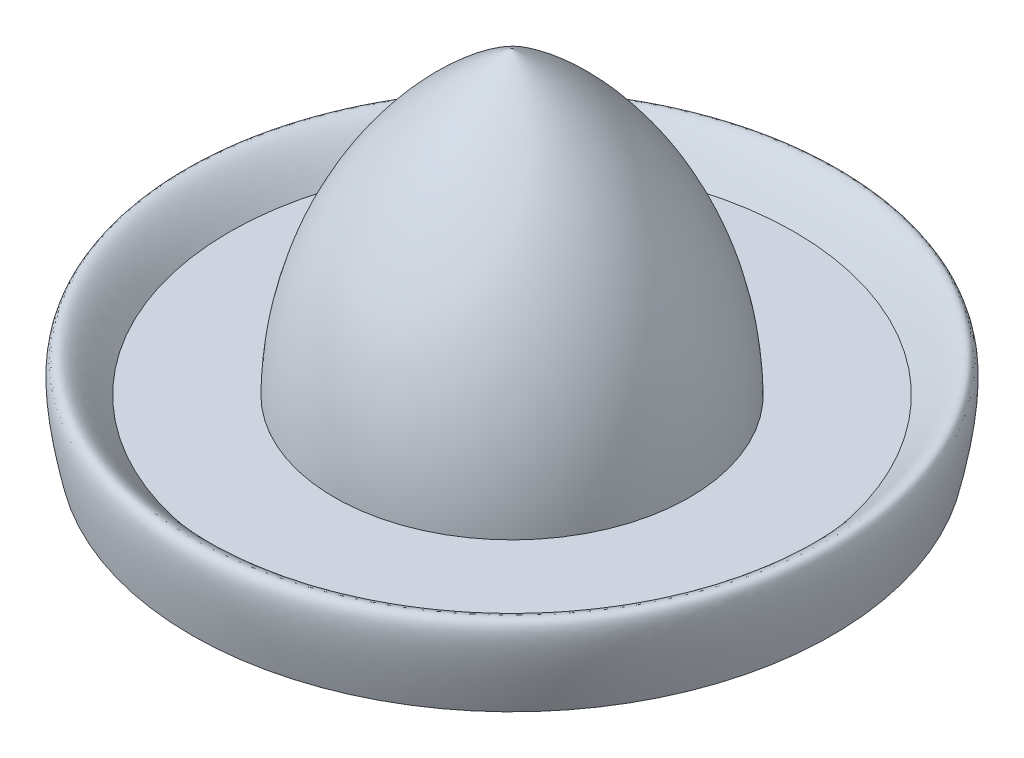
ISO-10303-21;
HEADER;
FILE_DESCRIPTION(('STEP AP214'),'2;1');
FILE_NAME('part.step','',(''),(''),'','','');
FILE_SCHEMA(('AUTOMOTIVE_DESIGN { 1 0 10303 214 1 1 1 1 }'));
ENDSEC;
DATA;
#1=APPLICATION_CONTEXT('core data for automotive mechanical design processes');
#2=APPLICATION_PROTOCOL_DEFINITION('international standard','automotive_design',2000,#1);
#3=PRODUCT_CONTEXT('',#1,'mechanical');
#4=PRODUCT('Part','Part','',(#3));
#5=PRODUCT_RELATED_PRODUCT_CATEGORY('part','',(#4));
#6=PRODUCT_DEFINITION_FORMATION('','',#4);
#7=PRODUCT_DEFINITION_CONTEXT('part definition',#1,'design');
#8=PRODUCT_DEFINITION('design','',#6,#7);
#9=PRODUCT_DEFINITION_SHAPE('','',#8);
#10=(LENGTH_UNIT() NAMED_UNIT(*) SI_UNIT(.MILLI.,.METRE.));
#11=(NAMED_UNIT(*) PLANE_ANGLE_UNIT() SI_UNIT($,.RADIAN.));
#12=(NAMED_UNIT(*) SI_UNIT($,.STERADIAN.) SOLID_ANGLE_UNIT());
#13=UNCERTAINTY_MEASURE_WITH_UNIT(LENGTH_MEASURE(1.E-05),#10,'distance_accuracy_value','');
#14=(GEOMETRIC_REPRESENTATION_CONTEXT(3) GLOBAL_UNCERTAINTY_ASSIGNED_CONTEXT((#13)) GLOBAL_UNIT_ASSIGNED_CONTEXT((#10,
#11,#12)) REPRESENTATION_CONTEXT('',''));
#15=CARTESIAN_POINT('',(0.,0.,0.));
#16=DIRECTION('',(0.,0.,1.));
#17=DIRECTION('',(1.,0.,0.));
#18=AXIS2_PLACEMENT_3D('',#15,#16,#17);
#19=CARTESIAN_POINT('',(0.,0.,-27.7002199708771));
#20=CARTESIAN_POINT('',(0.,11.8384178906218,-30.3370162707357));
#21=CARTESIAN_POINT('',(0.,4.15503299563157,-24.4265576106825));
#22=B_SPLINE_CURVE_WITH_KNOTS('',2,(#19,#20,#21),.UNSPECIFIED.,.F.,.F.,(3,3),(0.,1.),.UNSPECIFIED.);
#23=CARTESIAN_POINT('',(0.,0.,0.));
#24=DIRECTION('',(0.,-1.,0.));
#25=AXIS1_PLACEMENT('',#23,#24);
#26=SURFACE_OF_REVOLUTION('',#22,#25);
#27=CARTESIAN_POINT('',(0.,4.15503299563157,0.));
#28=DIRECTION('',(0.,-1.,0.));
#29=DIRECTION('',(0.,0.,-1.));
#30=AXIS2_PLACEMENT_3D('',#27,#28,#29);
#31=CIRCLE('',#30,24.4265576106825);
#32=CARTESIAN_POINT('',(0.,4.15503299563157,-24.4265576106825));
#33=VERTEX_POINT('',#32);
#34=EDGE_CURVE('E57',#33,#33,#31,.T.);
#35=ORIENTED_EDGE('',*,*,#34,.T.);
#36=EDGE_LOOP('',(#35));
#37=FACE_BOUND('',#36,.T.);
#38=CARTESIAN_POINT('',(0.,0.,0.));
#39=DIRECTION('',(0.,-1.,0.));
#40=DIRECTION('',(0.,0.,-1.));
#41=AXIS2_PLACEMENT_3D('',#38,#39,#40);
#42=CIRCLE('',#41,27.7002199708771);
#43=CARTESIAN_POINT('',(0.,0.,-27.7002199708771));
#44=VERTEX_POINT('',#43);
#45=EDGE_CURVE('E11',#44,#44,#42,.T.);
#46=ORIENTED_EDGE('',*,*,#45,.F.);
#47=EDGE_LOOP('',(#46));
#48=FACE_BOUND('',#47,.T.);
#49=ADVANCED_FACE('F33',(#37,#48),#26,.F.);
#50=CARTESIAN_POINT('',(0.,0.,-12.6744627212204));
#51=DIRECTION('',(0.,-1.,0.));
#52=DIRECTION('',(0.,0.,-1.));
#53=AXIS2_PLACEMENT_3D('',#50,#51,#52);
#54=PLANE('',#53);
#55=ORIENTED_EDGE('',*,*,#45,.T.);
#56=EDGE_LOOP('',(#55));
#57=FACE_BOUND('',#56,.T.);
#58=CARTESIAN_POINT('',(0.,0.,0.));
#59=DIRECTION('',(0.,-1.,0.));
#60=DIRECTION('',(0.,0.,-1.));
#61=AXIS2_PLACEMENT_3D('',#58,#59,#60);
#62=CIRCLE('',#61,12.6744627212204);
#63=CARTESIAN_POINT('',(0.,0.,-12.6744627212204));
#64=VERTEX_POINT('',#63);
#65=EDGE_CURVE('E41',#64,#64,#62,.T.);
#66=ORIENTED_EDGE('',*,*,#65,.F.);
#67=EDGE_LOOP('',(#66));
#68=FACE_BOUND('',#67,.T.);
#69=ADVANCED_FACE('F77',(#57,#68),#54,.T.);
#70=CARTESIAN_POINT('',(0.,2.14352921775327,18.9944099764996));
#71=DIRECTION('',(-1.,0.,0.));
#72=DIRECTION('',(0.,0.,-1.));
#73=AXIS2_PLACEMENT_3D('',#70,#71,#72);
#74=CIRCLE('',#73,31.7413329186371);
#75=TRIMMED_CURVE('',#74,(PARAMETER_VALUE(-0.929278135909203)),
(PARAMETER_VALUE(0.929278135909203)),.T.,.PARAMETER.);
#76=CARTESIAN_POINT('',(0.,2.14352921775327,0.));
#77=DIRECTION('',(0.,-1.,0.));
#78=AXIS1_PLACEMENT('',#76,#77);
#79=SURFACE_OF_REVOLUTION('',#75,#78);
#80=ORIENTED_EDGE('',*,*,#65,.T.);
#81=EDGE_LOOP('',(#80));
#82=FACE_BOUND('',#81,.T.);
#83=CARTESIAN_POINT('',(0.,27.5743098801004,0.));
#84=VERTEX_POINT('',#83);
#85=VERTEX_LOOP('',#84);
#86=FACE_BOUND('',#85,.T.);
#87=ADVANCED_FACE('F51',(#82,#86),#79,.F.);
#88=CARTESIAN_POINT('',(0.,3.73416746957279,14.9281615484272));
#89=DIRECTION('',(-1.,0.,0.));
#90=DIRECTION('',(0.,0.,-1.));
#91=AXIS2_PLACEMENT_3D('',#88,#89,#90);
#92=CIRCLE('',#91,30.2921164258213);
#93=TRIMMED_CURVE('',#92,(PARAMETER_VALUE(-1.05548379469308)),
(PARAMETER_VALUE(1.05548379469308)),.T.,.PARAMETER.);
#94=CARTESIAN_POINT('',(0.,3.73416746957279,0.));
#95=DIRECTION('',(0.,-1.,0.));
#96=AXIS1_PLACEMENT('',#94,#95);
#97=SURFACE_OF_REVOLUTION('',#93,#96);
#98=CARTESIAN_POINT('',(0.,30.0925116956347,0.));
#99=VERTEX_POINT('',#98);
#100=VERTEX_LOOP('',#99);
#101=FACE_BOUND('',#100,.T.);
#102=CARTESIAN_POINT('',(0.,4.15503299563157,0.));
#103=DIRECTION('',(0.,-1.,0.));
#104=DIRECTION('',(0.,0.,-1.));
#105=AXIS2_PLACEMENT_3D('',#102,#103,#104);
#106=CIRCLE('',#105,15.3610310747591);
#107=CARTESIAN_POINT('',(0.,4.15503299563157,-15.3610310747591));
#108=VERTEX_POINT('',#107);
#109=EDGE_CURVE('E55',#108,#108,#106,.T.);
#110=ORIENTED_EDGE('',*,*,#109,.F.);
#111=EDGE_LOOP('',(#110));
#112=FACE_BOUND('',#111,.T.);
#113=ADVANCED_FACE('F47',(#101,#112),#97,.T.);
#114=CARTESIAN_POINT('',(0.,4.15503299563157,-15.3610310747591));
#115=DIRECTION('',(0.,1.,0.));
#116=DIRECTION('',(0.,0.,1.));
#117=AXIS2_PLACEMENT_3D('',#114,#115,#116);
#118=PLANE('',#117);
#119=ORIENTED_EDGE('',*,*,#109,.T.);
#120=EDGE_LOOP('',(#119));
#121=FACE_BOUND('',#120,.T.);
#122=ORIENTED_EDGE('',*,*,#34,.F.);
#123=EDGE_LOOP('',(#122));
#124=FACE_BOUND('',#123,.T.);
#125=ADVANCED_FACE('F50',(#121,#124),#118,.T.);
#126=CLOSED_SHELL('',(#49,#69,#87,#113,#125));
#127=MANIFOLD_SOLID_BREP('B2',#126);
#128=ADVANCED_BREP_SHAPE_REPRESENTATION('',(#18,#127),#14);
#129=SHAPE_DEFINITION_REPRESENTATION(#9,#128);
ENDSEC;
END-ISO-10303-21;
